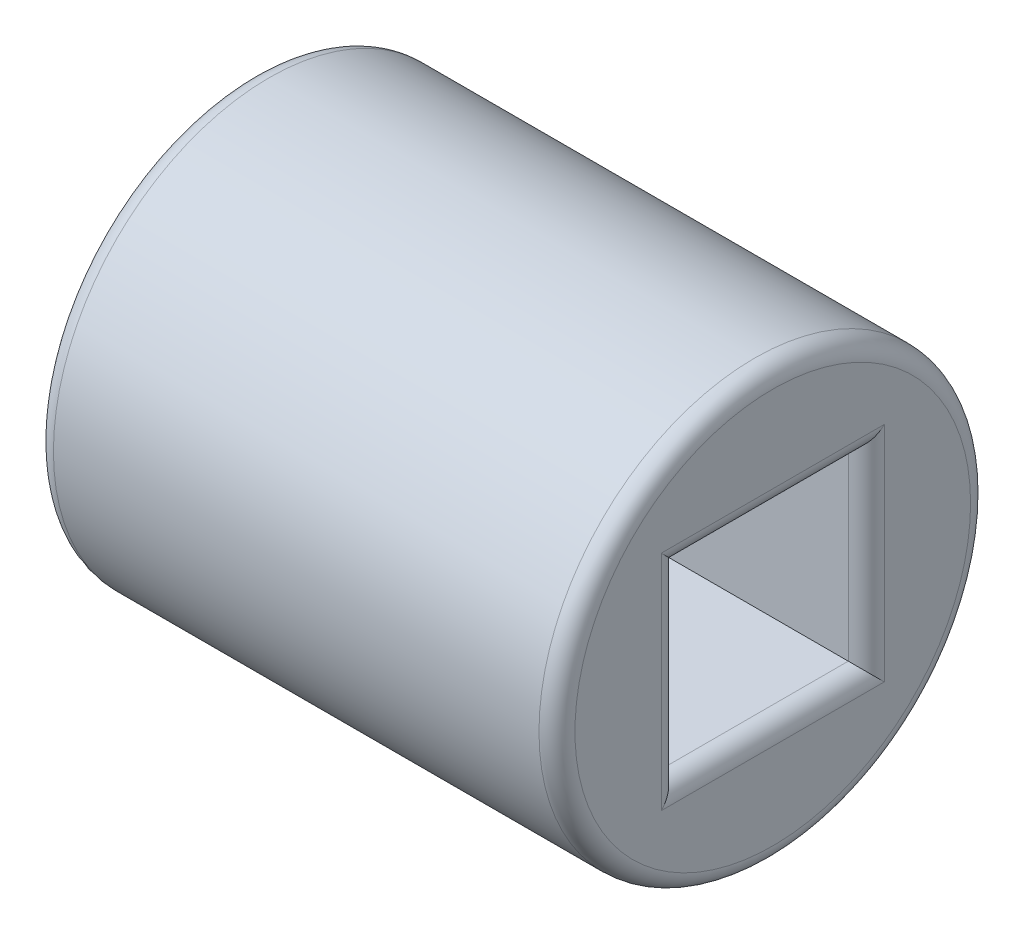
ISO-10303-21;
HEADER;
FILE_DESCRIPTION(('STEP AP214'),'2;1');
FILE_NAME('part.step','',(''),(''),'','','');
FILE_SCHEMA(('AUTOMOTIVE_DESIGN { 1 0 10303 214 1 1 1 1 }'));
ENDSEC;
DATA;
#1=APPLICATION_CONTEXT('core data for automotive mechanical design processes');
#2=APPLICATION_PROTOCOL_DEFINITION('international standard','automotive_design',2000,#1);
#3=PRODUCT_CONTEXT('',#1,'mechanical');
#4=PRODUCT('Part','Part','',(#3));
#5=PRODUCT_RELATED_PRODUCT_CATEGORY('part','',(#4));
#6=PRODUCT_DEFINITION_FORMATION('','',#4);
#7=PRODUCT_DEFINITION_CONTEXT('part definition',#1,'design');
#8=PRODUCT_DEFINITION('design','',#6,#7);
#9=PRODUCT_DEFINITION_SHAPE('','',#8);
#10=(LENGTH_UNIT() NAMED_UNIT(*) SI_UNIT(.MILLI.,.METRE.));
#11=(NAMED_UNIT(*) PLANE_ANGLE_UNIT() SI_UNIT($,.RADIAN.));
#12=(NAMED_UNIT(*) SI_UNIT($,.STERADIAN.) SOLID_ANGLE_UNIT());
#13=UNCERTAINTY_MEASURE_WITH_UNIT(LENGTH_MEASURE(1.E-05),#10,'distance_accuracy_value','');
#14=(GEOMETRIC_REPRESENTATION_CONTEXT(3) GLOBAL_UNCERTAINTY_ASSIGNED_CONTEXT((#13)) GLOBAL_UNIT_ASSIGNED_CONTEXT((#10,
#11,#12)) REPRESENTATION_CONTEXT('',''));
#15=CARTESIAN_POINT('',(0.,0.,0.));
#16=DIRECTION('',(0.,0.,1.));
#17=DIRECTION('',(1.,0.,0.));
#18=AXIS2_PLACEMENT_3D('',#15,#16,#17);
#19=CARTESIAN_POINT('',(18.415,0.,0.));
#20=DIRECTION('',(1.,0.,0.));
#21=DIRECTION('',(0.,0.,-1.));
#22=AXIS2_PLACEMENT_3D('',#19,#20,#21);
#23=PLANE('',#22);
#24=DIRECTION('',(0.,0.,-1.));
#25=VECTOR('',#24,1.);
#26=CARTESIAN_POINT('',(18.415,-3.937,0.));
#27=LINE('',#26,#25);
#28=CARTESIAN_POINT('',(18.415,-3.937,-3.937));
#29=VERTEX_POINT('',#28);
#30=CARTESIAN_POINT('',(18.415,-3.937,3.937));
#31=VERTEX_POINT('',#30);
#32=EDGE_CURVE('E46',#29,#31,#27,.F.);
#33=ORIENTED_EDGE('',*,*,#32,.T.);
#34=DIRECTION('',(0.,-1.,0.));
#35=VECTOR('',#34,1.);
#36=CARTESIAN_POINT('',(18.415,0.,3.937));
#37=LINE('',#36,#35);
#38=CARTESIAN_POINT('',(18.415,3.937,3.937));
#39=VERTEX_POINT('',#38);
#40=EDGE_CURVE('E11',#31,#39,#37,.F.);
#41=ORIENTED_EDGE('',*,*,#40,.T.);
#42=DIRECTION('',(0.,0.,1.));
#43=VECTOR('',#42,1.);
#44=CARTESIAN_POINT('',(18.415,3.937,0.));
#45=LINE('',#44,#43);
#46=CARTESIAN_POINT('',(18.415,3.937,-3.937));
#47=VERTEX_POINT('',#46);
#48=EDGE_CURVE('E158',#39,#47,#45,.F.);
#49=ORIENTED_EDGE('',*,*,#48,.T.);
#50=DIRECTION('',(0.,1.,0.));
#51=VECTOR('',#50,1.);
#52=CARTESIAN_POINT('',(18.415,0.,-3.937));
#53=LINE('',#52,#51);
#54=EDGE_CURVE('E57',#47,#29,#53,.F.);
#55=ORIENTED_EDGE('',*,*,#54,.T.);
#56=EDGE_LOOP('',(#33,#41,#49,#55));
#57=FACE_BOUND('',#56,.T.);
#58=CARTESIAN_POINT('',(18.415,0.,0.));
#59=DIRECTION('',(1.,0.,0.));
#60=DIRECTION('',(0.,0.,-1.));
#61=AXIS2_PLACEMENT_3D('',#58,#59,#60);
#62=CIRCLE('',#61,6.985);
#63=CARTESIAN_POINT('',(18.415,0.,-6.985));
#64=VERTEX_POINT('',#63);
#65=EDGE_CURVE('E155',#64,#64,#62,.T.);
#66=ORIENTED_EDGE('',*,*,#65,.T.);
#67=EDGE_LOOP('',(#66));
#68=FACE_BOUND('',#67,.T.);
#69=ADVANCED_FACE('F37',(#57,#68),#23,.T.);
#70=CARTESIAN_POINT('',(0.,0.,0.));
#71=DIRECTION('',(1.,0.,0.));
#72=DIRECTION('',(0.,0.,-1.));
#73=AXIS2_PLACEMENT_3D('',#70,#71,#72);
#74=PLANE('',#73);
#75=DIRECTION('',(0.,-1.,0.));
#76=VECTOR('',#75,1.);
#77=CARTESIAN_POINT('',(0.,-3.302,3.937));
#78=LINE('',#77,#76);
#79=CARTESIAN_POINT('',(0.,3.937,3.937));
#80=VERTEX_POINT('',#79);
#81=CARTESIAN_POINT('',(0.,-3.937,3.937));
#82=VERTEX_POINT('',#81);
#83=EDGE_CURVE('E127',#80,#82,#78,.T.);
#84=ORIENTED_EDGE('',*,*,#83,.T.);
#85=DIRECTION('',(0.,0.,-1.));
#86=VECTOR('',#85,1.);
#87=CARTESIAN_POINT('',(0.,-3.937,-3.302));
#88=LINE('',#87,#86);
#89=CARTESIAN_POINT('',(0.,-3.937,-3.937));
#90=VERTEX_POINT('',#89);
#91=EDGE_CURVE('E107',#82,#90,#88,.T.);
#92=ORIENTED_EDGE('',*,*,#91,.T.);
#93=DIRECTION('',(0.,1.,0.));
#94=VECTOR('',#93,1.);
#95=CARTESIAN_POINT('',(0.,3.302,-3.937));
#96=LINE('',#95,#94);
#97=CARTESIAN_POINT('',(0.,3.937,-3.937));
#98=VERTEX_POINT('',#97);
#99=EDGE_CURVE('E115',#90,#98,#96,.T.);
#100=ORIENTED_EDGE('',*,*,#99,.T.);
#101=DIRECTION('',(0.,0.,1.));
#102=VECTOR('',#101,1.);
#103=CARTESIAN_POINT('',(0.,3.937,3.302));
#104=LINE('',#103,#102);
#105=EDGE_CURVE('E121',#98,#80,#104,.T.);
#106=ORIENTED_EDGE('',*,*,#105,.T.);
#107=EDGE_LOOP('',(#84,#92,#100,#106));
#108=FACE_BOUND('',#107,.T.);
#109=CARTESIAN_POINT('',(0.,0.,0.));
#110=DIRECTION('',(1.,0.,0.));
#111=DIRECTION('',(0.,0.,-1.));
#112=AXIS2_PLACEMENT_3D('',#109,#110,#111);
#113=CIRCLE('',#112,6.985);
#114=CARTESIAN_POINT('',(0.,0.,-6.985));
#115=VERTEX_POINT('',#114);
#116=EDGE_CURVE('E122',#115,#115,#113,.F.);
#117=ORIENTED_EDGE('',*,*,#116,.T.);
#118=EDGE_LOOP('',(#117));
#119=FACE_BOUND('',#118,.T.);
#120=ADVANCED_FACE('F124',(#108,#119),#74,.F.);
#121=CARTESIAN_POINT('',(18.415,0.,0.));
#122=DIRECTION('',(-1.,0.,0.));
#123=DIRECTION('',(0.,0.,1.));
#124=AXIS2_PLACEMENT_3D('',#121,#122,#123);
#125=CYLINDRICAL_SURFACE('',#124,7.62);
#126=CARTESIAN_POINT('',(0.635,0.,0.));
#127=DIRECTION('',(1.,0.,0.));
#128=DIRECTION('',(0.,0.,-1.));
#129=AXIS2_PLACEMENT_3D('',#126,#127,#128);
#130=CIRCLE('',#129,7.62);
#131=CARTESIAN_POINT('',(0.635,0.,-7.62));
#132=VERTEX_POINT('',#131);
#133=EDGE_CURVE('E152',#132,#132,#130,.T.);
#134=ORIENTED_EDGE('',*,*,#133,.T.);
#135=EDGE_LOOP('',(#134));
#136=FACE_BOUND('',#135,.T.);
#137=CARTESIAN_POINT('',(17.78,0.,0.));
#138=DIRECTION('',(1.,0.,0.));
#139=DIRECTION('',(0.,0.,-1.));
#140=AXIS2_PLACEMENT_3D('',#137,#138,#139);
#141=CIRCLE('',#140,7.62);
#142=CARTESIAN_POINT('',(17.78,0.,-7.62));
#143=VERTEX_POINT('',#142);
#144=EDGE_CURVE('E149',#143,#143,#141,.F.);
#145=ORIENTED_EDGE('',*,*,#144,.T.);
#146=EDGE_LOOP('',(#145));
#147=FACE_BOUND('',#146,.T.);
#148=ADVANCED_FACE('F203',(#136,#147),#125,.T.);
#149=CARTESIAN_POINT('',(18.415,3.302,-3.302));
#150=DIRECTION('',(0.,0.,1.));
#151=DIRECTION('',(0.,-1.,0.));
#152=AXIS2_PLACEMENT_3D('',#149,#150,#151);
#153=PLANE('',#152);
#154=DIRECTION('',(-1.,0.,0.));
#155=VECTOR('',#154,1.);
#156=CARTESIAN_POINT('',(18.415,3.302,-3.302));
#157=LINE('',#156,#155);
#158=CARTESIAN_POINT('',(17.78,3.302,-3.302));
#159=VERTEX_POINT('',#158);
#160=CARTESIAN_POINT('',(0.635,3.302,-3.302));
#161=VERTEX_POINT('',#160);
#162=EDGE_CURVE('E386',#159,#161,#157,.T.);
#163=ORIENTED_EDGE('',*,*,#162,.T.);
#164=DIRECTION('',(0.,1.,0.));
#165=VECTOR('',#164,1.);
#166=CARTESIAN_POINT('',(0.635,-3.302,-3.302));
#167=LINE('',#166,#165);
#168=CARTESIAN_POINT('',(0.635,-3.302,-3.302));
#169=VERTEX_POINT('',#168);
#170=EDGE_CURVE('E147',#161,#169,#167,.F.);
#171=ORIENTED_EDGE('',*,*,#170,.T.);
#172=DIRECTION('',(-1.,0.,0.));
#173=VECTOR('',#172,1.);
#174=CARTESIAN_POINT('',(18.415,-3.302,-3.302));
#175=LINE('',#174,#173);
#176=CARTESIAN_POINT('',(17.78,-3.302,-3.302));
#177=VERTEX_POINT('',#176);
#178=EDGE_CURVE('E167',#177,#169,#175,.T.);
#179=ORIENTED_EDGE('',*,*,#178,.F.);
#180=DIRECTION('',(0.,1.,0.));
#181=VECTOR('',#180,1.);
#182=CARTESIAN_POINT('',(17.78,3.302,-3.302));
#183=LINE('',#182,#181);
#184=EDGE_CURVE('E145',#177,#159,#183,.T.);
#185=ORIENTED_EDGE('',*,*,#184,.T.);
#186=EDGE_LOOP('',(#163,#171,#179,#185));
#187=FACE_BOUND('',#186,.T.);
#188=ADVANCED_FACE('F205',(#187),#153,.T.);
#189=CARTESIAN_POINT('',(18.415,3.302,3.302));
#190=DIRECTION('',(0.,-1.,0.));
#191=DIRECTION('',(0.,0.,-1.));
#192=AXIS2_PLACEMENT_3D('',#189,#190,#191);
#193=PLANE('',#192);
#194=DIRECTION('',(-1.,0.,0.));
#195=VECTOR('',#194,1.);
#196=CARTESIAN_POINT('',(18.415,3.302,3.302));
#197=LINE('',#196,#195);
#198=CARTESIAN_POINT('',(17.78,3.302,3.302));
#199=VERTEX_POINT('',#198);
#200=CARTESIAN_POINT('',(0.635,3.302,3.302));
#201=VERTEX_POINT('',#200);
#202=EDGE_CURVE('E382',#199,#201,#197,.T.);
#203=ORIENTED_EDGE('',*,*,#202,.T.);
#204=DIRECTION('',(0.,0.,1.));
#205=VECTOR('',#204,1.);
#206=CARTESIAN_POINT('',(0.635,3.302,-3.302));
#207=LINE('',#206,#205);
#208=EDGE_CURVE('E143',#201,#161,#207,.F.);
#209=ORIENTED_EDGE('',*,*,#208,.T.);
#210=ORIENTED_EDGE('',*,*,#162,.F.);
#211=DIRECTION('',(0.,0.,1.));
#212=VECTOR('',#211,1.);
#213=CARTESIAN_POINT('',(17.78,3.302,3.302));
#214=LINE('',#213,#212);
#215=EDGE_CURVE('E141',#159,#199,#214,.T.);
#216=ORIENTED_EDGE('',*,*,#215,.T.);
#217=EDGE_LOOP('',(#203,#209,#210,#216));
#218=FACE_BOUND('',#217,.T.);
#219=ADVANCED_FACE('F212',(#218),#193,.T.);
#220=CARTESIAN_POINT('',(18.415,3.302,3.302));
#221=DIRECTION('',(0.,0.,-1.));
#222=DIRECTION('',(0.,1.,0.));
#223=AXIS2_PLACEMENT_3D('',#220,#221,#222);
#224=PLANE('',#223);
#225=DIRECTION('',(-1.,0.,0.));
#226=VECTOR('',#225,1.);
#227=CARTESIAN_POINT('',(18.415,-3.302,3.302));
#228=LINE('',#227,#226);
#229=CARTESIAN_POINT('',(17.78,-3.302,3.302));
#230=VERTEX_POINT('',#229);
#231=CARTESIAN_POINT('',(0.635,-3.302,3.302));
#232=VERTEX_POINT('',#231);
#233=EDGE_CURVE('E387',#230,#232,#228,.T.);
#234=ORIENTED_EDGE('',*,*,#233,.T.);
#235=DIRECTION('',(0.,-1.,0.));
#236=VECTOR('',#235,1.);
#237=CARTESIAN_POINT('',(0.635,3.302,3.302));
#238=LINE('',#237,#236);
#239=EDGE_CURVE('E139',#232,#201,#238,.F.);
#240=ORIENTED_EDGE('',*,*,#239,.T.);
#241=ORIENTED_EDGE('',*,*,#202,.F.);
#242=DIRECTION('',(0.,-1.,0.));
#243=VECTOR('',#242,1.);
#244=CARTESIAN_POINT('',(17.78,3.302,3.302));
#245=LINE('',#244,#243);
#246=EDGE_CURVE('E136',#199,#230,#245,.T.);
#247=ORIENTED_EDGE('',*,*,#246,.T.);
#248=EDGE_LOOP('',(#234,#240,#241,#247));
#249=FACE_BOUND('',#248,.T.);
#250=ADVANCED_FACE('F312',(#249),#224,.T.);
#251=CARTESIAN_POINT('',(18.415,-3.302,3.302));
#252=DIRECTION('',(0.,1.,0.));
#253=DIRECTION('',(0.,0.,1.));
#254=AXIS2_PLACEMENT_3D('',#251,#252,#253);
#255=PLANE('',#254);
#256=ORIENTED_EDGE('',*,*,#178,.T.);
#257=DIRECTION('',(0.,0.,-1.));
#258=VECTOR('',#257,1.);
#259=CARTESIAN_POINT('',(0.635,-3.302,3.302));
#260=LINE('',#259,#258);
#261=EDGE_CURVE('E109',#169,#232,#260,.F.);
#262=ORIENTED_EDGE('',*,*,#261,.T.);
#263=ORIENTED_EDGE('',*,*,#233,.F.);
#264=DIRECTION('',(0.,0.,-1.));
#265=VECTOR('',#264,1.);
#266=CARTESIAN_POINT('',(17.78,-3.302,3.302));
#267=LINE('',#266,#265);
#268=EDGE_CURVE('E129',#230,#177,#267,.T.);
#269=ORIENTED_EDGE('',*,*,#268,.T.);
#270=EDGE_LOOP('',(#256,#262,#263,#269));
#271=FACE_BOUND('',#270,.T.);
#272=ADVANCED_FACE('F229',(#271),#255,.T.);
#273=CARTESIAN_POINT('',(0.635,3.937,0.));
#274=DIRECTION('',(0.,0.,-1.));
#275=DIRECTION('',(-1.,0.,0.));
#276=AXIS2_PLACEMENT_3D('',#273,#274,#275);
#277=CYLINDRICAL_SURFACE('',#276,0.635);
#278=CARTESIAN_POINT('',(0.635,3.937,-3.937));
#279=DIRECTION('',(0.,-0.707106781186547,-0.707106781186548));
#280=DIRECTION('',(0.,0.707106781186548,-0.707106781186547));
#281=AXIS2_PLACEMENT_3D('',#278,#279,#280);
#282=ELLIPSE('',#281,0.898025612106915,0.635);
#283=EDGE_CURVE('E118',#161,#98,#282,.T.);
#284=ORIENTED_EDGE('',*,*,#283,.F.);
#285=ORIENTED_EDGE('',*,*,#208,.F.);
#286=CARTESIAN_POINT('',(0.635,3.937,3.937));
#287=DIRECTION('',(0.,0.707106781186548,-0.707106781186547));
#288=DIRECTION('',(0.,0.707106781186547,0.707106781186548));
#289=AXIS2_PLACEMENT_3D('',#286,#287,#288);
#290=ELLIPSE('',#289,0.898025612106915,0.635);
#291=EDGE_CURVE('E164',#80,#201,#290,.F.);
#292=ORIENTED_EDGE('',*,*,#291,.F.);
#293=ORIENTED_EDGE('',*,*,#105,.F.);
#294=EDGE_LOOP('',(#284,#285,#292,#293));
#295=FACE_BOUND('',#294,.T.);
#296=ADVANCED_FACE('F225',(#295),#277,.T.);
#297=CARTESIAN_POINT('',(0.635,0.,3.937));
#298=DIRECTION('',(0.,1.,0.));
#299=DIRECTION('',(0.,0.,1.));
#300=AXIS2_PLACEMENT_3D('',#297,#298,#299);
#301=CYLINDRICAL_SURFACE('',#300,0.635);
#302=ORIENTED_EDGE('',*,*,#291,.T.);
#303=ORIENTED_EDGE('',*,*,#239,.F.);
#304=CARTESIAN_POINT('',(0.635,-3.937,3.937));
#305=DIRECTION('',(0.,0.707106781186547,0.707106781186548));
#306=DIRECTION('',(0.,-0.707106781186548,0.707106781186547));
#307=AXIS2_PLACEMENT_3D('',#304,#305,#306);
#308=ELLIPSE('',#307,0.898025612106915,0.635);
#309=EDGE_CURVE('E112',#82,#232,#308,.F.);
#310=ORIENTED_EDGE('',*,*,#309,.F.);
#311=ORIENTED_EDGE('',*,*,#83,.F.);
#312=EDGE_LOOP('',(#302,#303,#310,#311));
#313=FACE_BOUND('',#312,.T.);
#314=ADVANCED_FACE('F222',(#313),#301,.T.);
#315=CARTESIAN_POINT('',(0.635,0.,-3.937));
#316=DIRECTION('',(0.,-1.,0.));
#317=DIRECTION('',(0.,0.,-1.));
#318=AXIS2_PLACEMENT_3D('',#315,#316,#317);
#319=CYLINDRICAL_SURFACE('',#318,0.635);
#320=ORIENTED_EDGE('',*,*,#283,.T.);
#321=ORIENTED_EDGE('',*,*,#99,.F.);
#322=CARTESIAN_POINT('',(0.635,-3.937,-3.937));
#323=DIRECTION('',(0.,-0.707106781186548,0.707106781186547));
#324=DIRECTION('',(0.,0.707106781186547,0.707106781186548));
#325=AXIS2_PLACEMENT_3D('',#322,#323,#324);
#326=ELLIPSE('',#325,0.898025612106915,0.635);
#327=EDGE_CURVE('E103',#169,#90,#326,.T.);
#328=ORIENTED_EDGE('',*,*,#327,.F.);
#329=ORIENTED_EDGE('',*,*,#170,.F.);
#330=EDGE_LOOP('',(#320,#321,#328,#329));
#331=FACE_BOUND('',#330,.T.);
#332=ADVANCED_FACE('F116',(#331),#319,.T.);
#333=CARTESIAN_POINT('',(0.635,-3.937,0.));
#334=DIRECTION('',(0.,0.,1.));
#335=DIRECTION('',(1.,0.,0.));
#336=AXIS2_PLACEMENT_3D('',#333,#334,#335);
#337=CYLINDRICAL_SURFACE('',#336,0.635);
#338=ORIENTED_EDGE('',*,*,#309,.T.);
#339=ORIENTED_EDGE('',*,*,#261,.F.);
#340=ORIENTED_EDGE('',*,*,#327,.T.);
#341=ORIENTED_EDGE('',*,*,#91,.F.);
#342=EDGE_LOOP('',(#338,#339,#340,#341));
#343=FACE_BOUND('',#342,.T.);
#344=ADVANCED_FACE('F105',(#343),#337,.T.);
#345=CARTESIAN_POINT('',(0.635,0.,0.));
#346=DIRECTION('',(1.,0.,0.));
#347=DIRECTION('',(0.,0.,-1.));
#348=AXIS2_PLACEMENT_3D('',#345,#346,#347);
#349=TOROIDAL_SURFACE('',#348,6.985,0.635);
#350=ORIENTED_EDGE('',*,*,#116,.F.);
#351=EDGE_LOOP('',(#350));
#352=FACE_BOUND('',#351,.T.);
#353=ORIENTED_EDGE('',*,*,#133,.F.);
#354=EDGE_LOOP('',(#353));
#355=FACE_BOUND('',#354,.T.);
#356=ADVANCED_FACE('F219',(#352,#355),#349,.T.);
#357=CARTESIAN_POINT('',(17.78,3.302,-3.937));
#358=DIRECTION('',(0.,1.,0.));
#359=DIRECTION('',(0.,0.,1.));
#360=AXIS2_PLACEMENT_3D('',#357,#358,#359);
#361=CYLINDRICAL_SURFACE('',#360,0.635);
#362=CARTESIAN_POINT('',(17.78,-3.937,-3.937));
#363=DIRECTION('',(0.,0.707106781186548,-0.707106781186547));
#364=DIRECTION('',(0.,-0.707106781186547,-0.707106781186548));
#365=AXIS2_PLACEMENT_3D('',#362,#363,#364);
#366=ELLIPSE('',#365,0.898025612106915,0.635);
#367=EDGE_CURVE('E171',#29,#177,#366,.F.);
#368=ORIENTED_EDGE('',*,*,#367,.F.);
#369=ORIENTED_EDGE('',*,*,#54,.F.);
#370=CARTESIAN_POINT('',(17.78,3.937,-3.937));
#371=DIRECTION('',(0.,0.707106781186547,0.707106781186548));
#372=DIRECTION('',(0.,0.707106781186548,-0.707106781186547));
#373=AXIS2_PLACEMENT_3D('',#370,#371,#372);
#374=ELLIPSE('',#373,0.898025612106915,0.635);
#375=EDGE_CURVE('E41',#159,#47,#374,.T.);
#376=ORIENTED_EDGE('',*,*,#375,.F.);
#377=ORIENTED_EDGE('',*,*,#184,.F.);
#378=EDGE_LOOP('',(#368,#369,#376,#377));
#379=FACE_BOUND('',#378,.T.);
#380=ADVANCED_FACE('F184',(#379),#361,.T.);
#381=CARTESIAN_POINT('',(17.78,3.937,3.302));
#382=DIRECTION('',(0.,0.,1.));
#383=DIRECTION('',(1.,0.,0.));
#384=AXIS2_PLACEMENT_3D('',#381,#382,#383);
#385=CYLINDRICAL_SURFACE('',#384,0.635);
#386=ORIENTED_EDGE('',*,*,#375,.T.);
#387=ORIENTED_EDGE('',*,*,#48,.F.);
#388=CARTESIAN_POINT('',(17.78,3.937,3.937));
#389=DIRECTION('',(0.,-0.707106781186548,0.707106781186547));
#390=DIRECTION('',(0.,-0.707106781186547,-0.707106781186548));
#391=AXIS2_PLACEMENT_3D('',#388,#389,#390);
#392=ELLIPSE('',#391,0.898025612106915,0.635);
#393=EDGE_CURVE('E170',#199,#39,#392,.T.);
#394=ORIENTED_EDGE('',*,*,#393,.F.);
#395=ORIENTED_EDGE('',*,*,#215,.F.);
#396=EDGE_LOOP('',(#386,#387,#394,#395));
#397=FACE_BOUND('',#396,.T.);
#398=ADVANCED_FACE('F180',(#397),#385,.T.);
#399=CARTESIAN_POINT('',(17.78,-3.937,3.302));
#400=DIRECTION('',(0.,0.,-1.));
#401=DIRECTION('',(-1.,0.,0.));
#402=AXIS2_PLACEMENT_3D('',#399,#400,#401);
#403=CYLINDRICAL_SURFACE('',#402,0.635);
#404=ORIENTED_EDGE('',*,*,#367,.T.);
#405=ORIENTED_EDGE('',*,*,#268,.F.);
#406=CARTESIAN_POINT('',(17.78,-3.937,3.937));
#407=DIRECTION('',(0.,-0.707106781186547,-0.707106781186548));
#408=DIRECTION('',(0.,-0.707106781186548,0.707106781186547));
#409=AXIS2_PLACEMENT_3D('',#406,#407,#408);
#410=ELLIPSE('',#409,0.898025612106915,0.635);
#411=EDGE_CURVE('E168',#31,#230,#410,.F.);
#412=ORIENTED_EDGE('',*,*,#411,.F.);
#413=ORIENTED_EDGE('',*,*,#32,.F.);
#414=EDGE_LOOP('',(#404,#405,#412,#413));
#415=FACE_BOUND('',#414,.T.);
#416=ADVANCED_FACE('F186',(#415),#403,.T.);
#417=CARTESIAN_POINT('',(17.78,3.302,3.937));
#418=DIRECTION('',(0.,-1.,0.));
#419=DIRECTION('',(0.,0.,-1.));
#420=AXIS2_PLACEMENT_3D('',#417,#418,#419);
#421=CYLINDRICAL_SURFACE('',#420,0.635);
#422=ORIENTED_EDGE('',*,*,#393,.T.);
#423=ORIENTED_EDGE('',*,*,#40,.F.);
#424=ORIENTED_EDGE('',*,*,#411,.T.);
#425=ORIENTED_EDGE('',*,*,#246,.F.);
#426=EDGE_LOOP('',(#422,#423,#424,#425));
#427=FACE_BOUND('',#426,.T.);
#428=ADVANCED_FACE('F189',(#427),#421,.T.);
#429=CARTESIAN_POINT('',(17.78,0.,0.));
#430=DIRECTION('',(1.,0.,0.));
#431=DIRECTION('',(0.,0.,-1.));
#432=AXIS2_PLACEMENT_3D('',#429,#430,#431);
#433=TOROIDAL_SURFACE('',#432,6.985,0.635);
#434=ORIENTED_EDGE('',*,*,#144,.F.);
#435=EDGE_LOOP('',(#434));
#436=FACE_BOUND('',#435,.T.);
#437=ORIENTED_EDGE('',*,*,#65,.F.);
#438=EDGE_LOOP('',(#437));
#439=FACE_BOUND('',#438,.T.);
#440=ADVANCED_FACE('F39',(#436,#439),#433,.T.);
#441=CLOSED_SHELL('',(#69,#120,#148,#188,#219,#250,#272,#296,#314,#332,#344,#356,#380,#398,#416,
#428,#440));
#442=MANIFOLD_SOLID_BREP('B2',#441);
#443=ADVANCED_BREP_SHAPE_REPRESENTATION('',(#18,#442),#14);
#444=SHAPE_DEFINITION_REPRESENTATION(#9,#443);
ENDSEC;
END-ISO-10303-21;
